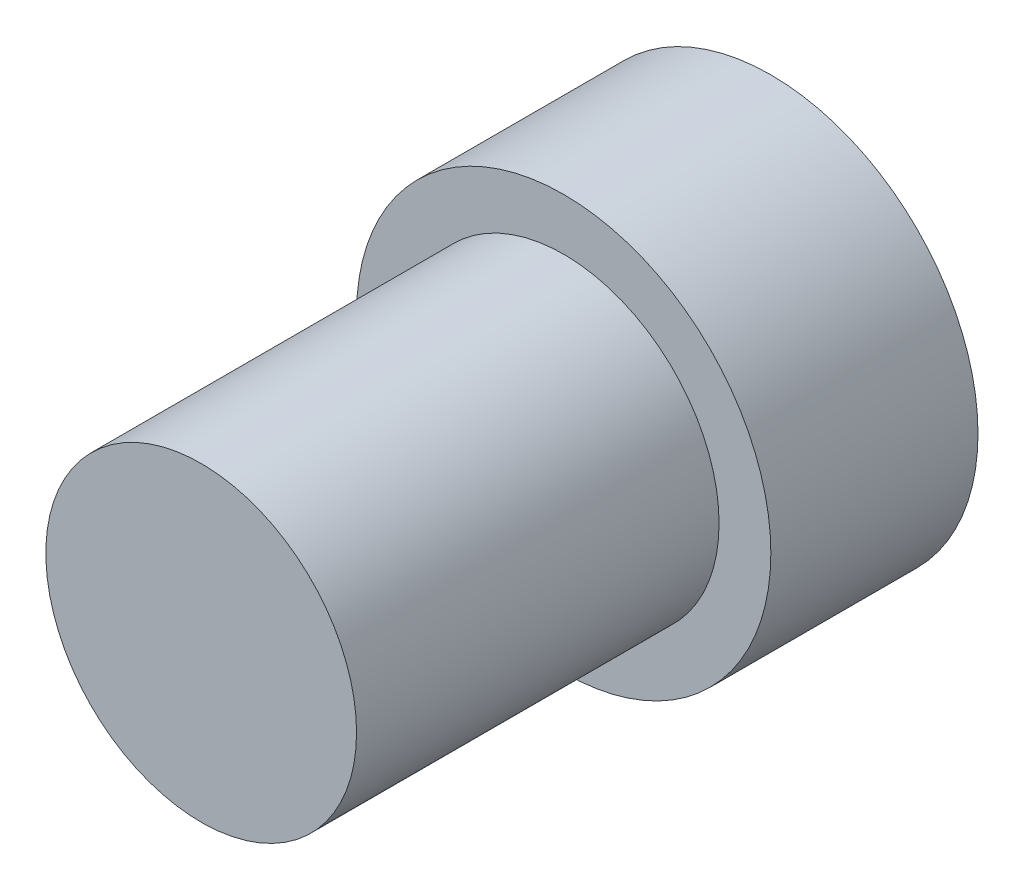
ISO-10303-21;
HEADER;
FILE_DESCRIPTION(('STEP AP214'),'2;1');
FILE_NAME('part.step','',(''),(''),'','','');
FILE_SCHEMA(('AUTOMOTIVE_DESIGN { 1 0 10303 214 1 1 1 1 }'));
ENDSEC;
DATA;
#1=APPLICATION_CONTEXT('core data for automotive mechanical design processes');
#2=APPLICATION_PROTOCOL_DEFINITION('international standard','automotive_design',2000,#1);
#3=PRODUCT_CONTEXT('',#1,'mechanical');
#4=PRODUCT('Part','Part','',(#3));
#5=PRODUCT_RELATED_PRODUCT_CATEGORY('part','',(#4));
#6=PRODUCT_DEFINITION_FORMATION('','',#4);
#7=PRODUCT_DEFINITION_CONTEXT('part definition',#1,'design');
#8=PRODUCT_DEFINITION('design','',#6,#7);
#9=PRODUCT_DEFINITION_SHAPE('','',#8);
#10=(LENGTH_UNIT() NAMED_UNIT(*) SI_UNIT(.MILLI.,.METRE.));
#11=(NAMED_UNIT(*) PLANE_ANGLE_UNIT() SI_UNIT($,.RADIAN.));
#12=(NAMED_UNIT(*) SI_UNIT($,.STERADIAN.) SOLID_ANGLE_UNIT());
#13=UNCERTAINTY_MEASURE_WITH_UNIT(LENGTH_MEASURE(1.E-05),#10,'distance_accuracy_value','');
#14=(GEOMETRIC_REPRESENTATION_CONTEXT(3) GLOBAL_UNCERTAINTY_ASSIGNED_CONTEXT((#13)) GLOBAL_UNIT_ASSIGNED_CONTEXT((#10,
#11,#12)) REPRESENTATION_CONTEXT('',''));
#15=CARTESIAN_POINT('',(0.,0.,0.));
#16=DIRECTION('',(0.,0.,1.));
#17=DIRECTION('',(1.,0.,0.));
#18=AXIS2_PLACEMENT_3D('',#15,#16,#17);
#19=CARTESIAN_POINT('',(0.,0.,4.));
#20=DIRECTION('',(0.,0.,-1.));
#21=DIRECTION('',(-1.,0.,0.));
#22=AXIS2_PLACEMENT_3D('',#19,#20,#21);
#23=CYLINDRICAL_SURFACE('',#22,4.);
#24=CARTESIAN_POINT('',(0.,0.,4.));
#25=DIRECTION('',(0.,0.,1.));
#26=DIRECTION('',(1.,0.,0.));
#27=AXIS2_PLACEMENT_3D('',#24,#25,#26);
#28=CIRCLE('',#27,4.);
#29=CARTESIAN_POINT('',(4.,0.,4.));
#30=VERTEX_POINT('',#29);
#31=EDGE_CURVE('E45',#30,#30,#28,.T.);
#32=ORIENTED_EDGE('',*,*,#31,.F.);
#33=EDGE_LOOP('',(#32));
#34=FACE_BOUND('',#33,.T.);
#35=CARTESIAN_POINT('',(0.,0.,0.));
#36=DIRECTION('',(0.,0.,1.));
#37=DIRECTION('',(1.,0.,0.));
#38=AXIS2_PLACEMENT_3D('',#35,#36,#37);
#39=CIRCLE('',#38,4.);
#40=CARTESIAN_POINT('',(4.,0.,0.));
#41=VERTEX_POINT('',#40);
#42=EDGE_CURVE('E40',#41,#41,#39,.T.);
#43=ORIENTED_EDGE('',*,*,#42,.T.);
#44=EDGE_LOOP('',(#43));
#45=FACE_BOUND('',#44,.T.);
#46=ADVANCED_FACE('F37',(#34,#45),#23,.T.);
#47=CARTESIAN_POINT('',(0.,0.,4.));
#48=DIRECTION('',(0.,0.,1.));
#49=DIRECTION('',(1.,0.,0.));
#50=AXIS2_PLACEMENT_3D('',#47,#48,#49);
#51=PLANE('',#50);
#52=CARTESIAN_POINT('',(0.,0.,4.));
#53=DIRECTION('',(0.,0.,1.));
#54=DIRECTION('',(1.,0.,0.));
#55=AXIS2_PLACEMENT_3D('',#52,#53,#54);
#56=CIRCLE('',#55,3.);
#57=CARTESIAN_POINT('',(3.,0.,4.));
#58=VERTEX_POINT('',#57);
#59=EDGE_CURVE('E10',#58,#58,#56,.T.);
#60=ORIENTED_EDGE('',*,*,#59,.F.);
#61=EDGE_LOOP('',(#60));
#62=FACE_BOUND('',#61,.T.);
#63=ORIENTED_EDGE('',*,*,#31,.T.);
#64=EDGE_LOOP('',(#63));
#65=FACE_BOUND('',#64,.T.);
#66=ADVANCED_FACE('F65',(#62,#65),#51,.T.);
#67=CARTESIAN_POINT('',(0.,0.,0.));
#68=DIRECTION('',(0.,0.,1.));
#69=DIRECTION('',(1.,0.,0.));
#70=AXIS2_PLACEMENT_3D('',#67,#68,#69);
#71=PLANE('',#70);
#72=ORIENTED_EDGE('',*,*,#42,.F.);
#73=EDGE_LOOP('',(#72));
#74=FACE_BOUND('',#73,.T.);
#75=ADVANCED_FACE('F62',(#74),#71,.F.);
#76=CARTESIAN_POINT('',(0.,0.,11.));
#77=DIRECTION('',(0.,0.,-1.));
#78=DIRECTION('',(-1.,0.,0.));
#79=AXIS2_PLACEMENT_3D('',#76,#77,#78);
#80=CYLINDRICAL_SURFACE('',#79,3.);
#81=CARTESIAN_POINT('',(0.,0.,11.));
#82=DIRECTION('',(0.,0.,1.));
#83=DIRECTION('',(1.,0.,0.));
#84=AXIS2_PLACEMENT_3D('',#81,#82,#83);
#85=CIRCLE('',#84,3.);
#86=CARTESIAN_POINT('',(3.,0.,11.));
#87=VERTEX_POINT('',#86);
#88=EDGE_CURVE('E52',#87,#87,#85,.T.);
#89=ORIENTED_EDGE('',*,*,#88,.F.);
#90=EDGE_LOOP('',(#89));
#91=FACE_BOUND('',#90,.T.);
#92=ORIENTED_EDGE('',*,*,#59,.T.);
#93=EDGE_LOOP('',(#92));
#94=FACE_BOUND('',#93,.T.);
#95=ADVANCED_FACE('F64',(#91,#94),#80,.T.);
#96=CARTESIAN_POINT('',(0.,0.,11.));
#97=DIRECTION('',(0.,0.,1.));
#98=DIRECTION('',(1.,0.,0.));
#99=AXIS2_PLACEMENT_3D('',#96,#97,#98);
#100=PLANE('',#99);
#101=ORIENTED_EDGE('',*,*,#88,.T.);
#102=EDGE_LOOP('',(#101));
#103=FACE_BOUND('',#102,.T.);
#104=ADVANCED_FACE('F70',(#103),#100,.T.);
#105=CLOSED_SHELL('',(#46,#66,#75,#95,#104));
#106=MANIFOLD_SOLID_BREP('B2',#105);
#107=ADVANCED_BREP_SHAPE_REPRESENTATION('',(#18,#106),#14);
#108=SHAPE_DEFINITION_REPRESENTATION(#9,#107);
ENDSEC;
END-ISO-10303-21;
